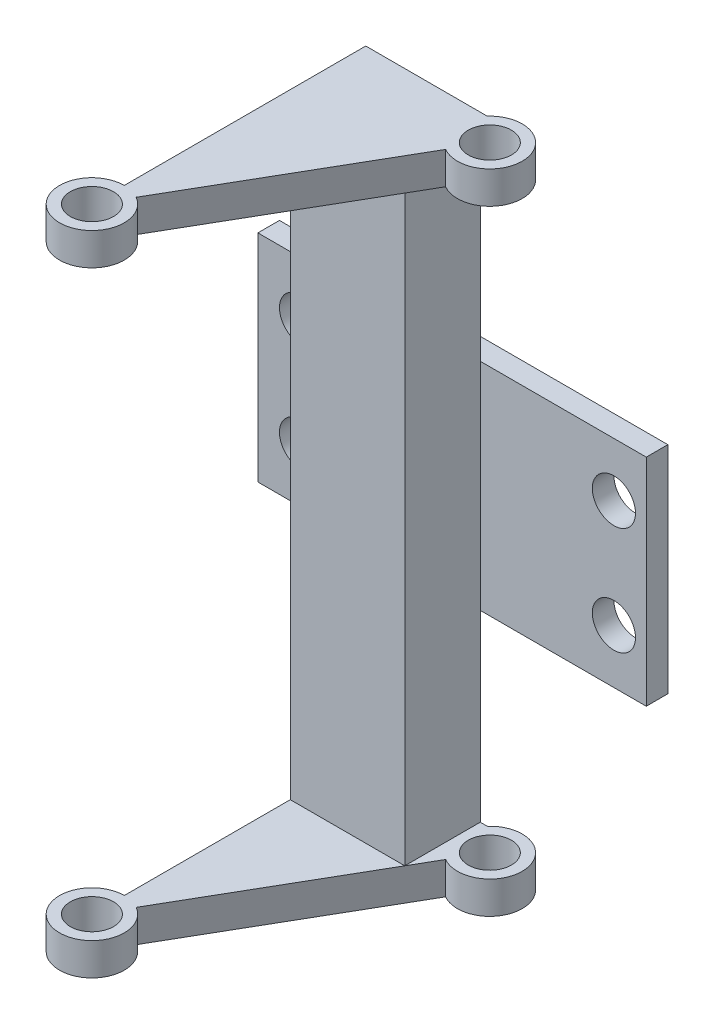
ISO-10303-21;
HEADER;
FILE_DESCRIPTION(('STEP AP214'),'2;1');
FILE_NAME('part.step','',(''),(''),'','','');
FILE_SCHEMA(('AUTOMOTIVE_DESIGN { 1 0 10303 214 1 1 1 1 }'));
ENDSEC;
DATA;
#1=APPLICATION_CONTEXT('core data for automotive mechanical design processes');
#2=APPLICATION_PROTOCOL_DEFINITION('international standard','automotive_design',2000,#1);
#3=PRODUCT_CONTEXT('',#1,'mechanical');
#4=PRODUCT('Part','Part','',(#3));
#5=PRODUCT_RELATED_PRODUCT_CATEGORY('part','',(#4));
#6=PRODUCT_DEFINITION_FORMATION('','',#4);
#7=PRODUCT_DEFINITION_CONTEXT('part definition',#1,'design');
#8=PRODUCT_DEFINITION('design','',#6,#7);
#9=PRODUCT_DEFINITION_SHAPE('','',#8);
#10=(LENGTH_UNIT() NAMED_UNIT(*) SI_UNIT(.MILLI.,.METRE.));
#11=(NAMED_UNIT(*) PLANE_ANGLE_UNIT() SI_UNIT($,.RADIAN.));
#12=(NAMED_UNIT(*) SI_UNIT($,.STERADIAN.) SOLID_ANGLE_UNIT());
#13=UNCERTAINTY_MEASURE_WITH_UNIT(LENGTH_MEASURE(1.E-05),#10,'distance_accuracy_value','');
#14=(GEOMETRIC_REPRESENTATION_CONTEXT(3) GLOBAL_UNCERTAINTY_ASSIGNED_CONTEXT((#13)) GLOBAL_UNIT_ASSIGNED_CONTEXT((#10,
#11,#12)) REPRESENTATION_CONTEXT('',''));
#15=CARTESIAN_POINT('',(0.,0.,0.));
#16=DIRECTION('',(0.,0.,1.));
#17=DIRECTION('',(1.,0.,0.));
#18=AXIS2_PLACEMENT_3D('',#15,#16,#17);
#19=CARTESIAN_POINT('',(0.,0.,1.));
#20=DIRECTION('',(0.,0.,-1.));
#21=DIRECTION('',(-1.,0.,0.));
#22=AXIS2_PLACEMENT_3D('',#19,#20,#21);
#23=PLANE('',#22);
#24=CARTESIAN_POINT('',(4.,15.,1.));
#25=DIRECTION('',(0.,0.,1.));
#26=DIRECTION('',(1.,0.,0.));
#27=AXIS2_PLACEMENT_3D('',#24,#25,#26);
#28=CIRCLE('',#27,2.);
#29=CARTESIAN_POINT('',(6.,15.,1.));
#30=VERTEX_POINT('',#29);
#31=EDGE_CURVE('E112',#30,#30,#28,.T.);
#32=ORIENTED_EDGE('',*,*,#31,.F.);
#33=EDGE_LOOP('',(#32));
#34=FACE_BOUND('',#33,.T.);
#35=CARTESIAN_POINT('',(4.,5.,1.));
#36=DIRECTION('',(0.,0.,1.));
#37=DIRECTION('',(1.,0.,0.));
#38=AXIS2_PLACEMENT_3D('',#35,#36,#37);
#39=CIRCLE('',#38,2.);
#40=CARTESIAN_POINT('',(6.,5.,1.));
#41=VERTEX_POINT('',#40);
#42=EDGE_CURVE('E157',#41,#41,#39,.T.);
#43=ORIENTED_EDGE('',*,*,#42,.F.);
#44=EDGE_LOOP('',(#43));
#45=FACE_BOUND('',#44,.T.);
#46=DIRECTION('',(0.,-1.,0.));
#47=VECTOR('',#46,1.);
#48=CARTESIAN_POINT('',(10.,37.,1.));
#49=LINE('',#48,#47);
#50=CARTESIAN_POINT('',(10.,20.,1.));
#51=VERTEX_POINT('',#50);
#52=CARTESIAN_POINT('',(10.,0.,1.));
#53=VERTEX_POINT('',#52);
#54=EDGE_CURVE('E11',#51,#53,#49,.T.);
#55=ORIENTED_EDGE('',*,*,#54,.F.);
#56=DIRECTION('',(-1.,0.,0.));
#57=VECTOR('',#56,1.);
#58=CARTESIAN_POINT('',(0.,20.,1.));
#59=LINE('',#58,#57);
#60=CARTESIAN_POINT('',(0.,20.,1.));
#61=VERTEX_POINT('',#60);
#62=EDGE_CURVE('E68',#51,#61,#59,.T.);
#63=ORIENTED_EDGE('',*,*,#62,.T.);
#64=DIRECTION('',(0.,-1.,0.));
#65=VECTOR('',#64,1.);
#66=CARTESIAN_POINT('',(0.,0.,1.));
#67=LINE('',#66,#65);
#68=CARTESIAN_POINT('',(0.,0.,1.));
#69=VERTEX_POINT('',#68);
#70=EDGE_CURVE('E96',#61,#69,#67,.T.);
#71=ORIENTED_EDGE('',*,*,#70,.T.);
#72=DIRECTION('',(1.,0.,0.));
#73=VECTOR('',#72,1.);
#74=CARTESIAN_POINT('',(0.,0.,1.));
#75=LINE('',#74,#73);
#76=EDGE_CURVE('E169',#69,#53,#75,.T.);
#77=ORIENTED_EDGE('',*,*,#76,.T.);
#78=EDGE_LOOP('',(#55,#63,#71,#77));
#79=FACE_BOUND('',#78,.T.);
#80=ADVANCED_FACE('F39',(#34,#45,#79),#23,.F.);
#81=CARTESIAN_POINT('',(33.,15.,1.));
#82=DIRECTION('',(0.,0.,1.));
#83=DIRECTION('',(1.,0.,0.));
#84=AXIS2_PLACEMENT_3D('',#81,#82,#83);
#85=CIRCLE('',#84,2.);
#86=CARTESIAN_POINT('',(35.,15.,1.));
#87=VERTEX_POINT('',#86);
#88=EDGE_CURVE('E127',#87,#87,#85,.T.);
#89=ORIENTED_EDGE('',*,*,#88,.F.);
#90=EDGE_LOOP('',(#89));
#91=FACE_BOUND('',#90,.T.);
#92=CARTESIAN_POINT('',(33.,5.,1.));
#93=DIRECTION('',(0.,0.,1.));
#94=DIRECTION('',(1.,0.,0.));
#95=AXIS2_PLACEMENT_3D('',#92,#93,#94);
#96=CIRCLE('',#95,2.);
#97=CARTESIAN_POINT('',(35.,5.,1.));
#98=VERTEX_POINT('',#97);
#99=EDGE_CURVE('E135',#98,#98,#96,.T.);
#100=ORIENTED_EDGE('',*,*,#99,.F.);
#101=EDGE_LOOP('',(#100));
#102=FACE_BOUND('',#101,.T.);
#103=CARTESIAN_POINT('',(36.,20.,1.));
#104=VERTEX_POINT('',#103);
#105=CARTESIAN_POINT('',(20.6143351817255,20.,1.));
#106=VERTEX_POINT('',#105);
#107=EDGE_CURVE('E105',#104,#106,#59,.T.);
#108=ORIENTED_EDGE('',*,*,#107,.T.);
#109=DIRECTION('',(0.,-1.,0.));
#110=VECTOR('',#109,1.);
#111=CARTESIAN_POINT('',(20.6143351817255,37.,1.));
#112=LINE('',#111,#110);
#113=CARTESIAN_POINT('',(20.6143351817255,0.,1.));
#114=VERTEX_POINT('',#113);
#115=EDGE_CURVE('E49',#106,#114,#112,.T.);
#116=ORIENTED_EDGE('',*,*,#115,.T.);
#117=CARTESIAN_POINT('',(36.,0.,1.));
#118=VERTEX_POINT('',#117);
#119=EDGE_CURVE('E168',#114,#118,#75,.T.);
#120=ORIENTED_EDGE('',*,*,#119,.T.);
#121=DIRECTION('',(0.,-1.,0.));
#122=VECTOR('',#121,1.);
#123=CARTESIAN_POINT('',(36.,20.,1.));
#124=LINE('',#123,#122);
#125=EDGE_CURVE('E133',#104,#118,#124,.T.);
#126=ORIENTED_EDGE('',*,*,#125,.F.);
#127=EDGE_LOOP('',(#108,#116,#120,#126));
#128=FACE_BOUND('',#127,.T.);
#129=ADVANCED_FACE('F186',(#91,#102,#128),#23,.F.);
#130=CARTESIAN_POINT('',(0.,0.,-1.));
#131=DIRECTION('',(0.,0.,-1.));
#132=DIRECTION('',(-1.,0.,0.));
#133=AXIS2_PLACEMENT_3D('',#130,#131,#132);
#134=PLANE('',#133);
#135=CARTESIAN_POINT('',(33.,15.,-1.));
#136=DIRECTION('',(0.,0.,-1.));
#137=DIRECTION('',(-1.,0.,0.));
#138=AXIS2_PLACEMENT_3D('',#135,#136,#137);
#139=CIRCLE('',#138,2.);
#140=CARTESIAN_POINT('',(31.,15.,-1.));
#141=VERTEX_POINT('',#140);
#142=EDGE_CURVE('E43',#141,#141,#139,.T.);
#143=ORIENTED_EDGE('',*,*,#142,.F.);
#144=EDGE_LOOP('',(#143));
#145=FACE_BOUND('',#144,.T.);
#146=CARTESIAN_POINT('',(33.,5.,-1.));
#147=DIRECTION('',(0.,0.,-1.));
#148=DIRECTION('',(-1.,0.,0.));
#149=AXIS2_PLACEMENT_3D('',#146,#147,#148);
#150=CIRCLE('',#149,2.);
#151=CARTESIAN_POINT('',(31.,5.,-1.));
#152=VERTEX_POINT('',#151);
#153=EDGE_CURVE('E124',#152,#152,#150,.T.);
#154=ORIENTED_EDGE('',*,*,#153,.F.);
#155=EDGE_LOOP('',(#154));
#156=FACE_BOUND('',#155,.T.);
#157=CARTESIAN_POINT('',(4.,15.,-1.));
#158=DIRECTION('',(0.,0.,1.));
#159=DIRECTION('',(1.,0.,0.));
#160=AXIS2_PLACEMENT_3D('',#157,#158,#159);
#161=CIRCLE('',#160,2.);
#162=CARTESIAN_POINT('',(6.,15.,-1.));
#163=VERTEX_POINT('',#162);
#164=EDGE_CURVE('E118',#163,#163,#161,.T.);
#165=ORIENTED_EDGE('',*,*,#164,.T.);
#166=EDGE_LOOP('',(#165));
#167=FACE_BOUND('',#166,.T.);
#168=DIRECTION('',(0.,-1.,0.));
#169=VECTOR('',#168,1.);
#170=CARTESIAN_POINT('',(0.,0.,-1.));
#171=LINE('',#170,#169);
#172=CARTESIAN_POINT('',(0.,20.,-1.));
#173=VERTEX_POINT('',#172);
#174=CARTESIAN_POINT('',(0.,0.,-1.));
#175=VERTEX_POINT('',#174);
#176=EDGE_CURVE('E102',#173,#175,#171,.T.);
#177=ORIENTED_EDGE('',*,*,#176,.F.);
#178=DIRECTION('',(-1.,0.,0.));
#179=VECTOR('',#178,1.);
#180=CARTESIAN_POINT('',(0.,20.,-1.));
#181=LINE('',#180,#179);
#182=CARTESIAN_POINT('',(36.,20.,-1.));
#183=VERTEX_POINT('',#182);
#184=EDGE_CURVE('E82',#183,#173,#181,.T.);
#185=ORIENTED_EDGE('',*,*,#184,.F.);
#186=DIRECTION('',(0.,1.,0.));
#187=VECTOR('',#186,1.);
#188=CARTESIAN_POINT('',(36.,20.,-1.));
#189=LINE('',#188,#187);
#190=CARTESIAN_POINT('',(36.,0.,-1.));
#191=VERTEX_POINT('',#190);
#192=EDGE_CURVE('E151',#191,#183,#189,.T.);
#193=ORIENTED_EDGE('',*,*,#192,.F.);
#194=DIRECTION('',(1.,0.,0.));
#195=VECTOR('',#194,1.);
#196=CARTESIAN_POINT('',(0.,0.,-1.));
#197=LINE('',#196,#195);
#198=EDGE_CURVE('E97',#175,#191,#197,.T.);
#199=ORIENTED_EDGE('',*,*,#198,.F.);
#200=EDGE_LOOP('',(#177,#185,#193,#199));
#201=FACE_BOUND('',#200,.T.);
#202=CARTESIAN_POINT('',(4.,5.,-1.));
#203=DIRECTION('',(0.,0.,1.));
#204=DIRECTION('',(1.,0.,0.));
#205=AXIS2_PLACEMENT_3D('',#202,#203,#204);
#206=CIRCLE('',#205,2.);
#207=CARTESIAN_POINT('',(6.,5.,-1.));
#208=VERTEX_POINT('',#207);
#209=EDGE_CURVE('E156',#208,#208,#206,.T.);
#210=ORIENTED_EDGE('',*,*,#209,.T.);
#211=EDGE_LOOP('',(#210));
#212=FACE_BOUND('',#211,.T.);
#213=ADVANCED_FACE('F107',(#145,#156,#167,#201,#212),#134,.T.);
#214=CARTESIAN_POINT('',(0.,0.,1.));
#215=DIRECTION('',(1.,0.,0.));
#216=DIRECTION('',(0.,0.,-1.));
#217=AXIS2_PLACEMENT_3D('',#214,#215,#216);
#218=PLANE('',#217);
#219=ORIENTED_EDGE('',*,*,#176,.T.);
#220=DIRECTION('',(0.,0.,-1.));
#221=VECTOR('',#220,1.);
#222=CARTESIAN_POINT('',(0.,0.,1.));
#223=LINE('',#222,#221);
#224=EDGE_CURVE('E104',#69,#175,#223,.T.);
#225=ORIENTED_EDGE('',*,*,#224,.F.);
#226=ORIENTED_EDGE('',*,*,#70,.F.);
#227=DIRECTION('',(0.,0.,-1.));
#228=VECTOR('',#227,1.);
#229=CARTESIAN_POINT('',(0.,20.,1.));
#230=LINE('',#229,#228);
#231=EDGE_CURVE('E85',#61,#173,#230,.T.);
#232=ORIENTED_EDGE('',*,*,#231,.T.);
#233=EDGE_LOOP('',(#219,#225,#226,#232));
#234=FACE_BOUND('',#233,.T.);
#235=ADVANCED_FACE('F41',(#234),#218,.F.);
#236=CARTESIAN_POINT('',(0.,0.,1.));
#237=DIRECTION('',(0.,1.,0.));
#238=DIRECTION('',(0.,0.,1.));
#239=AXIS2_PLACEMENT_3D('',#236,#237,#238);
#240=PLANE('',#239);
#241=ORIENTED_EDGE('',*,*,#198,.T.);
#242=DIRECTION('',(0.,0.,-1.));
#243=VECTOR('',#242,1.);
#244=CARTESIAN_POINT('',(36.,0.,1.));
#245=LINE('',#244,#243);
#246=EDGE_CURVE('E147',#118,#191,#245,.T.);
#247=ORIENTED_EDGE('',*,*,#246,.F.);
#248=ORIENTED_EDGE('',*,*,#119,.F.);
#249=EDGE_CURVE('E172',#53,#114,#75,.T.);
#250=ORIENTED_EDGE('',*,*,#249,.F.);
#251=ORIENTED_EDGE('',*,*,#76,.F.);
#252=ORIENTED_EDGE('',*,*,#224,.T.);
#253=EDGE_LOOP('',(#241,#247,#248,#250,#251,#252));
#254=FACE_BOUND('',#253,.T.);
#255=ADVANCED_FACE('F192',(#254),#240,.F.);
#256=CARTESIAN_POINT('',(0.,20.,1.));
#257=DIRECTION('',(0.,-1.,0.));
#258=DIRECTION('',(0.,0.,-1.));
#259=AXIS2_PLACEMENT_3D('',#256,#257,#258);
#260=PLANE('',#259);
#261=ORIENTED_EDGE('',*,*,#184,.T.);
#262=ORIENTED_EDGE('',*,*,#231,.F.);
#263=ORIENTED_EDGE('',*,*,#62,.F.);
#264=EDGE_CURVE('E176',#106,#51,#59,.T.);
#265=ORIENTED_EDGE('',*,*,#264,.F.);
#266=ORIENTED_EDGE('',*,*,#107,.F.);
#267=DIRECTION('',(0.,0.,1.));
#268=VECTOR('',#267,1.);
#269=CARTESIAN_POINT('',(36.,20.,1.));
#270=LINE('',#269,#268);
#271=EDGE_CURVE('E90',#183,#104,#270,.T.);
#272=ORIENTED_EDGE('',*,*,#271,.F.);
#273=EDGE_LOOP('',(#261,#262,#263,#265,#266,#272));
#274=FACE_BOUND('',#273,.T.);
#275=ADVANCED_FACE('F84',(#274),#260,.F.);
#276=CARTESIAN_POINT('',(4.,15.,1.));
#277=DIRECTION('',(0.,0.,-1.));
#278=DIRECTION('',(-1.,0.,0.));
#279=AXIS2_PLACEMENT_3D('',#276,#277,#278);
#280=CYLINDRICAL_SURFACE('',#279,2.);
#281=ORIENTED_EDGE('',*,*,#31,.T.);
#282=EDGE_LOOP('',(#281));
#283=FACE_BOUND('',#282,.T.);
#284=ORIENTED_EDGE('',*,*,#164,.F.);
#285=EDGE_LOOP('',(#284));
#286=FACE_BOUND('',#285,.T.);
#287=ADVANCED_FACE('F517',(#283,#286),#280,.F.);
#288=CARTESIAN_POINT('',(4.,5.,1.));
#289=DIRECTION('',(0.,0.,-1.));
#290=DIRECTION('',(-1.,0.,0.));
#291=AXIS2_PLACEMENT_3D('',#288,#289,#290);
#292=CYLINDRICAL_SURFACE('',#291,2.);
#293=ORIENTED_EDGE('',*,*,#42,.T.);
#294=EDGE_LOOP('',(#293));
#295=FACE_BOUND('',#294,.T.);
#296=ORIENTED_EDGE('',*,*,#209,.F.);
#297=EDGE_LOOP('',(#296));
#298=FACE_BOUND('',#297,.T.);
#299=ADVANCED_FACE('F769',(#295,#298),#292,.F.);
#300=CARTESIAN_POINT('',(36.,0.,0.));
#301=DIRECTION('',(1.,0.,0.));
#302=DIRECTION('',(0.,1.,0.));
#303=AXIS2_PLACEMENT_3D('',#300,#301,#302);
#304=PLANE('',#303);
#305=ORIENTED_EDGE('',*,*,#125,.T.);
#306=ORIENTED_EDGE('',*,*,#246,.T.);
#307=ORIENTED_EDGE('',*,*,#192,.T.);
#308=ORIENTED_EDGE('',*,*,#271,.T.);
#309=EDGE_LOOP('',(#305,#306,#307,#308));
#310=FACE_BOUND('',#309,.T.);
#311=ADVANCED_FACE('F194',(#310),#304,.T.);
#312=CARTESIAN_POINT('',(33.,5.,-5.));
#313=DIRECTION('',(0.,0.,1.));
#314=DIRECTION('',(1.,0.,0.));
#315=AXIS2_PLACEMENT_3D('',#312,#313,#314);
#316=CYLINDRICAL_SURFACE('',#315,2.);
#317=ORIENTED_EDGE('',*,*,#153,.T.);
#318=EDGE_LOOP('',(#317));
#319=FACE_BOUND('',#318,.T.);
#320=ORIENTED_EDGE('',*,*,#99,.T.);
#321=EDGE_LOOP('',(#320));
#322=FACE_BOUND('',#321,.T.);
#323=ADVANCED_FACE('F764',(#319,#322),#316,.F.);
#324=CARTESIAN_POINT('',(33.,15.,-5.));
#325=DIRECTION('',(0.,0.,1.));
#326=DIRECTION('',(1.,0.,0.));
#327=AXIS2_PLACEMENT_3D('',#324,#325,#326);
#328=CYLINDRICAL_SURFACE('',#327,2.);
#329=ORIENTED_EDGE('',*,*,#142,.T.);
#330=EDGE_LOOP('',(#329));
#331=FACE_BOUND('',#330,.T.);
#332=ORIENTED_EDGE('',*,*,#88,.T.);
#333=EDGE_LOOP('',(#332));
#334=FACE_BOUND('',#333,.T.);
#335=ADVANCED_FACE('F568',(#331,#334),#328,.F.);
#336=CARTESIAN_POINT('',(10.,37.,1.));
#337=DIRECTION('',(0.,0.,1.));
#338=DIRECTION('',(1.,0.,0.));
#339=AXIS2_PLACEMENT_3D('',#336,#337,#338);
#340=PLANE('',#339);
#341=CARTESIAN_POINT('',(10.,-20.,1.));
#342=VERTEX_POINT('',#341);
#343=EDGE_CURVE('E52',#53,#342,#49,.T.);
#344=ORIENTED_EDGE('',*,*,#343,.F.);
#345=ORIENTED_EDGE('',*,*,#249,.T.);
#346=CARTESIAN_POINT('',(20.6143351817255,-17.,1.));
#347=VERTEX_POINT('',#346);
#348=EDGE_CURVE('E59',#114,#347,#112,.T.);
#349=ORIENTED_EDGE('',*,*,#348,.T.);
#350=DIRECTION('',(1.,0.,0.));
#351=VECTOR('',#350,1.);
#352=CARTESIAN_POINT('',(10.,-17.,1.));
#353=LINE('',#352,#351);
#354=CARTESIAN_POINT('',(21.2639320225002,-17.,1.));
#355=VERTEX_POINT('',#354);
#356=EDGE_CURVE('E364',#347,#355,#353,.T.);
#357=ORIENTED_EDGE('',*,*,#356,.T.);
#358=DIRECTION('',(0.,1.,0.));
#359=VECTOR('',#358,1.);
#360=CARTESIAN_POINT('',(21.2639320225002,-20.,1.));
#361=LINE('',#360,#359);
#362=CARTESIAN_POINT('',(21.2639320225002,-20.,1.));
#363=VERTEX_POINT('',#362);
#364=EDGE_CURVE('E413',#363,#355,#361,.T.);
#365=ORIENTED_EDGE('',*,*,#364,.F.);
#366=DIRECTION('',(1.,0.,0.));
#367=VECTOR('',#366,1.);
#368=CARTESIAN_POINT('',(10.,-20.,1.));
#369=LINE('',#368,#367);
#370=EDGE_CURVE('E372',#342,#363,#369,.T.);
#371=ORIENTED_EDGE('',*,*,#370,.F.);
#372=EDGE_LOOP('',(#344,#345,#349,#357,#365,#371));
#373=FACE_BOUND('',#372,.T.);
#374=ADVANCED_FACE('F453',(#373),#340,.F.);
#375=CARTESIAN_POINT('',(20.6143351817255,37.,1.));
#376=VERTEX_POINT('',#375);
#377=EDGE_CURVE('E432',#376,#106,#112,.T.);
#378=ORIENTED_EDGE('',*,*,#377,.T.);
#379=ORIENTED_EDGE('',*,*,#264,.T.);
#380=CARTESIAN_POINT('',(10.,40.,1.));
#381=VERTEX_POINT('',#380);
#382=EDGE_CURVE('E51',#381,#51,#49,.T.);
#383=ORIENTED_EDGE('',*,*,#382,.F.);
#384=DIRECTION('',(1.,0.,0.));
#385=VECTOR('',#384,1.);
#386=CARTESIAN_POINT('',(0.,40.,1.));
#387=LINE('',#386,#385);
#388=CARTESIAN_POINT('',(21.2639320225002,40.,0.999999999999999));
#389=VERTEX_POINT('',#388);
#390=EDGE_CURVE('E298',#381,#389,#387,.T.);
#391=ORIENTED_EDGE('',*,*,#390,.T.);
#392=DIRECTION('',(0.,-1.,0.));
#393=VECTOR('',#392,1.);
#394=CARTESIAN_POINT('',(21.2639320225002,40.,0.999999999999999));
#395=LINE('',#394,#393);
#396=CARTESIAN_POINT('',(21.2639320225002,37.,0.999999999999999));
#397=VERTEX_POINT('',#396);
#398=EDGE_CURVE('E280',#389,#397,#395,.T.);
#399=ORIENTED_EDGE('',*,*,#398,.T.);
#400=DIRECTION('',(1.,0.,0.));
#401=VECTOR('',#400,1.);
#402=CARTESIAN_POINT('',(0.,37.,1.));
#403=LINE('',#402,#401);
#404=EDGE_CURVE('E327',#376,#397,#403,.T.);
#405=ORIENTED_EDGE('',*,*,#404,.F.);
#406=EDGE_LOOP('',(#378,#379,#383,#391,#399,#405));
#407=FACE_BOUND('',#406,.T.);
#408=ADVANCED_FACE('F305',(#407),#340,.F.);
#409=CARTESIAN_POINT('',(10.,37.,7.99811807886541));
#410=DIRECTION('',(1.,0.,0.));
#411=DIRECTION('',(0.,0.,-1.));
#412=AXIS2_PLACEMENT_3D('',#409,#410,#411);
#413=PLANE('',#412);
#414=ORIENTED_EDGE('',*,*,#343,.T.);
#415=DIRECTION('',(0.,0.,-1.));
#416=VECTOR('',#415,1.);
#417=CARTESIAN_POINT('',(10.,-20.,3.));
#418=LINE('',#417,#416);
#419=CARTESIAN_POINT('',(10.,-20.,23.3826859021798));
#420=VERTEX_POINT('',#419);
#421=EDGE_CURVE('E368',#420,#342,#418,.T.);
#422=ORIENTED_EDGE('',*,*,#421,.F.);
#423=DIRECTION('',(0.,1.,0.));
#424=VECTOR('',#423,1.);
#425=CARTESIAN_POINT('',(10.,-20.,23.3826859021798));
#426=LINE('',#425,#424);
#427=CARTESIAN_POINT('',(10.,-17.,23.3826859021798));
#428=VERTEX_POINT('',#427);
#429=EDGE_CURVE('E386',#420,#428,#426,.T.);
#430=ORIENTED_EDGE('',*,*,#429,.T.);
#431=DIRECTION('',(0.,0.,-1.));
#432=VECTOR('',#431,1.);
#433=CARTESIAN_POINT('',(10.,-17.,3.));
#434=LINE('',#433,#432);
#435=CARTESIAN_POINT('',(10.,-17.,7.99811807886541));
#436=VERTEX_POINT('',#435);
#437=EDGE_CURVE('E373',#428,#436,#434,.T.);
#438=ORIENTED_EDGE('',*,*,#437,.T.);
#439=DIRECTION('',(0.,-1.,0.));
#440=VECTOR('',#439,1.);
#441=CARTESIAN_POINT('',(10.,37.,7.99811807886541));
#442=LINE('',#441,#440);
#443=CARTESIAN_POINT('',(10.,37.,7.99811807886541));
#444=VERTEX_POINT('',#443);
#445=EDGE_CURVE('E438',#444,#436,#442,.T.);
#446=ORIENTED_EDGE('',*,*,#445,.F.);
#447=DIRECTION('',(0.,0.,-1.));
#448=VECTOR('',#447,1.);
#449=CARTESIAN_POINT('',(10.,37.,0.));
#450=LINE('',#449,#448);
#451=CARTESIAN_POINT('',(10.,37.,23.3826859021798));
#452=VERTEX_POINT('',#451);
#453=EDGE_CURVE('E309',#452,#444,#450,.T.);
#454=ORIENTED_EDGE('',*,*,#453,.F.);
#455=DIRECTION('',(0.,-1.,0.));
#456=VECTOR('',#455,1.);
#457=CARTESIAN_POINT('',(10.,40.,23.3826859021798));
#458=LINE('',#457,#456);
#459=CARTESIAN_POINT('',(10.,40.,23.3826859021798));
#460=VERTEX_POINT('',#459);
#461=EDGE_CURVE('E341',#460,#452,#458,.T.);
#462=ORIENTED_EDGE('',*,*,#461,.F.);
#463=DIRECTION('',(0.,0.,-1.));
#464=VECTOR('',#463,1.);
#465=CARTESIAN_POINT('',(10.,40.,0.));
#466=LINE('',#465,#464);
#467=EDGE_CURVE('E291',#460,#381,#466,.T.);
#468=ORIENTED_EDGE('',*,*,#467,.T.);
#469=ORIENTED_EDGE('',*,*,#382,.T.);
#470=ORIENTED_EDGE('',*,*,#54,.T.);
#471=EDGE_LOOP('',(#414,#422,#430,#438,#446,#454,#462,#468,#469,#470));
#472=FACE_BOUND('',#471,.T.);
#473=ADVANCED_FACE('F447',(#472),#413,.F.);
#474=CARTESIAN_POINT('',(20.6143351817255,37.,7.99811807886541));
#475=DIRECTION('',(0.,0.,-1.));
#476=DIRECTION('',(-1.,0.,0.));
#477=AXIS2_PLACEMENT_3D('',#474,#475,#476);
#478=PLANE('',#477);
#479=DIRECTION('',(1.,0.,0.));
#480=VECTOR('',#479,1.);
#481=CARTESIAN_POINT('',(20.6143351817255,-17.,7.99811807886541));
#482=LINE('',#481,#480);
#483=CARTESIAN_POINT('',(20.6143351817255,-17.,7.99811807886541));
#484=VERTEX_POINT('',#483);
#485=EDGE_CURVE('E417',#436,#484,#482,.T.);
#486=ORIENTED_EDGE('',*,*,#485,.T.);
#487=DIRECTION('',(0.,-1.,0.));
#488=VECTOR('',#487,1.);
#489=CARTESIAN_POINT('',(20.6143351817255,37.,7.99811807886541));
#490=LINE('',#489,#488);
#491=CARTESIAN_POINT('',(20.6143351817255,37.,7.99811807886541));
#492=VERTEX_POINT('',#491);
#493=EDGE_CURVE('E435',#492,#484,#490,.T.);
#494=ORIENTED_EDGE('',*,*,#493,.F.);
#495=DIRECTION('',(1.,0.,0.));
#496=VECTOR('',#495,1.);
#497=CARTESIAN_POINT('',(20.6143351817255,37.,7.99811807886541));
#498=LINE('',#497,#496);
#499=EDGE_CURVE('E418',#444,#492,#498,.T.);
#500=ORIENTED_EDGE('',*,*,#499,.F.);
#501=ORIENTED_EDGE('',*,*,#445,.T.);
#502=EDGE_LOOP('',(#486,#494,#500,#501));
#503=FACE_BOUND('',#502,.T.);
#504=ADVANCED_FACE('F463',(#503),#478,.F.);
#505=CARTESIAN_POINT('',(20.6143351817255,37.,1.));
#506=DIRECTION('',(-1.,0.,0.));
#507=DIRECTION('',(0.,0.,1.));
#508=AXIS2_PLACEMENT_3D('',#505,#506,#507);
#509=PLANE('',#508);
#510=DIRECTION('',(0.,0.,-1.));
#511=VECTOR('',#510,1.);
#512=CARTESIAN_POINT('',(20.6143351817255,-17.,1.));
#513=LINE('',#512,#511);
#514=EDGE_CURVE('E423',#484,#347,#513,.T.);
#515=ORIENTED_EDGE('',*,*,#514,.T.);
#516=ORIENTED_EDGE('',*,*,#348,.F.);
#517=ORIENTED_EDGE('',*,*,#115,.F.);
#518=ORIENTED_EDGE('',*,*,#377,.F.);
#519=DIRECTION('',(0.,0.,-1.));
#520=VECTOR('',#519,1.);
#521=CARTESIAN_POINT('',(20.6143351817255,37.,1.));
#522=LINE('',#521,#520);
#523=EDGE_CURVE('E422',#492,#376,#522,.T.);
#524=ORIENTED_EDGE('',*,*,#523,.F.);
#525=ORIENTED_EDGE('',*,*,#493,.T.);
#526=EDGE_LOOP('',(#515,#516,#517,#518,#524,#525));
#527=FACE_BOUND('',#526,.T.);
#528=ADVANCED_FACE('F456',(#527),#509,.F.);
#529=CARTESIAN_POINT('',(23.5,-17.,3.));
#530=DIRECTION('',(0.,-1.,0.));
#531=DIRECTION('',(0.,0.,-1.));
#532=AXIS2_PLACEMENT_3D('',#529,#530,#531);
#533=PLANE('',#532);
#534=ORIENTED_EDGE('',*,*,#514,.F.);
#535=DIRECTION('',(-0.5,0.,0.866025403784439));
#536=VECTOR('',#535,1.);
#537=CARTESIAN_POINT('',(11.5,-17.,23.7846096908265));
#538=LINE('',#537,#536);
#539=CARTESIAN_POINT('',(22.,-17.,5.59807621135332));
#540=VERTEX_POINT('',#539);
#541=EDGE_CURVE('E393',#540,#484,#538,.T.);
#542=ORIENTED_EDGE('',*,*,#541,.F.);
#543=CARTESIAN_POINT('',(23.5,-17.,3.));
#544=DIRECTION('',(0.,-1.,0.));
#545=DIRECTION('',(0.,0.,-1.));
#546=AXIS2_PLACEMENT_3D('',#543,#544,#545);
#547=CIRCLE('',#546,3.);
#548=EDGE_CURVE('E389',#355,#540,#547,.T.);
#549=ORIENTED_EDGE('',*,*,#548,.F.);
#550=ORIENTED_EDGE('',*,*,#356,.F.);
#551=EDGE_LOOP('',(#534,#542,#549,#550));
#552=FACE_BOUND('',#551,.T.);
#553=CARTESIAN_POINT('',(23.5,-17.,3.));
#554=DIRECTION('',(0.,-1.,0.));
#555=DIRECTION('',(0.,0.,-1.));
#556=AXIS2_PLACEMENT_3D('',#553,#554,#555);
#557=CIRCLE('',#556,2.);
#558=CARTESIAN_POINT('',(23.5,-17.,0.999999999999997));
#559=VERTEX_POINT('',#558);
#560=EDGE_CURVE('E356',#559,#559,#557,.T.);
#561=ORIENTED_EDGE('',*,*,#560,.T.);
#562=EDGE_LOOP('',(#561));
#563=FACE_BOUND('',#562,.T.);
#564=ADVANCED_FACE('F460',(#552,#563),#533,.F.);
#565=CARTESIAN_POINT('',(23.5,-20.,3.));
#566=DIRECTION('',(0.,-1.,0.));
#567=DIRECTION('',(0.,0.,-1.));
#568=AXIS2_PLACEMENT_3D('',#565,#566,#567);
#569=PLANE('',#568);
#570=CARTESIAN_POINT('',(23.5,-20.,3.));
#571=DIRECTION('',(0.,-1.,0.));
#572=DIRECTION('',(0.,0.,-1.));
#573=AXIS2_PLACEMENT_3D('',#570,#571,#572);
#574=CIRCLE('',#573,2.);
#575=CARTESIAN_POINT('',(23.5,-20.,0.999999999999997));
#576=VERTEX_POINT('',#575);
#577=EDGE_CURVE('E360',#576,#576,#574,.T.);
#578=ORIENTED_EDGE('',*,*,#577,.F.);
#579=EDGE_LOOP('',(#578));
#580=FACE_BOUND('',#579,.T.);
#581=ORIENTED_EDGE('',*,*,#421,.T.);
#582=ORIENTED_EDGE('',*,*,#370,.T.);
#583=CARTESIAN_POINT('',(23.5,-20.,3.));
#584=DIRECTION('',(0.,-1.,0.));
#585=DIRECTION('',(0.,0.,-1.));
#586=AXIS2_PLACEMENT_3D('',#583,#584,#585);
#587=CIRCLE('',#586,3.);
#588=CARTESIAN_POINT('',(22.,-20.,5.59807621135332));
#589=VERTEX_POINT('',#588);
#590=EDGE_CURVE('E376',#363,#589,#587,.T.);
#591=ORIENTED_EDGE('',*,*,#590,.T.);
#592=DIRECTION('',(-0.5,0.,0.866025403784439));
#593=VECTOR('',#592,1.);
#594=CARTESIAN_POINT('',(11.5,-20.,23.7846096908265));
#595=LINE('',#594,#593);
#596=CARTESIAN_POINT('',(11.5,-20.,23.7846096908265));
#597=VERTEX_POINT('',#596);
#598=EDGE_CURVE('E379',#589,#597,#595,.T.);
#599=ORIENTED_EDGE('',*,*,#598,.T.);
#600=CARTESIAN_POINT('',(10.,-20.,26.3826859021798));
#601=DIRECTION('',(0.,-1.,0.));
#602=DIRECTION('',(0.,0.,-1.));
#603=AXIS2_PLACEMENT_3D('',#600,#601,#602);
#604=CIRCLE('',#603,3.);
#605=EDGE_CURVE('E382',#597,#420,#604,.T.);
#606=ORIENTED_EDGE('',*,*,#605,.T.);
#607=EDGE_LOOP('',(#581,#582,#591,#599,#606));
#608=FACE_BOUND('',#607,.T.);
#609=CARTESIAN_POINT('',(10.,-20.,26.3826859021798));
#610=DIRECTION('',(0.,-1.,0.));
#611=DIRECTION('',(0.,0.,-1.));
#612=AXIS2_PLACEMENT_3D('',#609,#610,#611);
#613=CIRCLE('',#612,2.);
#614=CARTESIAN_POINT('',(10.,-20.,24.3826859021798));
#615=VERTEX_POINT('',#614);
#616=EDGE_CURVE('E352',#615,#615,#613,.T.);
#617=ORIENTED_EDGE('',*,*,#616,.F.);
#618=EDGE_LOOP('',(#617));
#619=FACE_BOUND('',#618,.T.);
#620=ADVANCED_FACE('F484',(#580,#608,#619),#569,.T.);
#621=ORIENTED_EDGE('',*,*,#485,.F.);
#622=ORIENTED_EDGE('',*,*,#437,.F.);
#623=CARTESIAN_POINT('',(10.,-17.,26.3826859021798));
#624=DIRECTION('',(0.,-1.,0.));
#625=DIRECTION('',(0.,0.,-1.));
#626=AXIS2_PLACEMENT_3D('',#623,#624,#625);
#627=CIRCLE('',#626,3.);
#628=CARTESIAN_POINT('',(11.5,-17.,23.7846096908265));
#629=VERTEX_POINT('',#628);
#630=EDGE_CURVE('E396',#629,#428,#627,.T.);
#631=ORIENTED_EDGE('',*,*,#630,.F.);
#632=EDGE_CURVE('E392',#484,#629,#538,.T.);
#633=ORIENTED_EDGE('',*,*,#632,.F.);
#634=EDGE_LOOP('',(#621,#622,#631,#633));
#635=FACE_BOUND('',#634,.T.);
#636=CARTESIAN_POINT('',(10.,-17.,26.3826859021798));
#637=DIRECTION('',(0.,-1.,0.));
#638=DIRECTION('',(0.,0.,-1.));
#639=AXIS2_PLACEMENT_3D('',#636,#637,#638);
#640=CIRCLE('',#639,2.);
#641=CARTESIAN_POINT('',(10.,-17.,24.3826859021798));
#642=VERTEX_POINT('',#641);
#643=EDGE_CURVE('E345',#642,#642,#640,.T.);
#644=ORIENTED_EDGE('',*,*,#643,.T.);
#645=EDGE_LOOP('',(#644));
#646=FACE_BOUND('',#645,.T.);
#647=ADVANCED_FACE('F467',(#635,#646),#533,.F.);
#648=CARTESIAN_POINT('',(23.5,-20.,3.));
#649=DIRECTION('',(0.,1.,0.));
#650=DIRECTION('',(0.,0.,1.));
#651=AXIS2_PLACEMENT_3D('',#648,#649,#650);
#652=CYLINDRICAL_SURFACE('',#651,3.);
#653=ORIENTED_EDGE('',*,*,#548,.T.);
#654=DIRECTION('',(0.,1.,0.));
#655=VECTOR('',#654,1.);
#656=CARTESIAN_POINT('',(22.,-20.,5.59807621135332));
#657=LINE('',#656,#655);
#658=EDGE_CURVE('E409',#589,#540,#657,.T.);
#659=ORIENTED_EDGE('',*,*,#658,.F.);
#660=ORIENTED_EDGE('',*,*,#590,.F.);
#661=ORIENTED_EDGE('',*,*,#364,.T.);
#662=EDGE_LOOP('',(#653,#659,#660,#661));
#663=FACE_BOUND('',#662,.T.);
#664=ADVANCED_FACE('F482',(#663),#652,.T.);
#665=CARTESIAN_POINT('',(11.5,-20.,23.7846096908265));
#666=DIRECTION('',(-0.866025403784439,0.,-0.5));
#667=DIRECTION('',(-0.5,0.,0.866025403784439));
#668=AXIS2_PLACEMENT_3D('',#665,#666,#667);
#669=PLANE('',#668);
#670=ORIENTED_EDGE('',*,*,#541,.T.);
#671=ORIENTED_EDGE('',*,*,#632,.T.);
#672=DIRECTION('',(0.,1.,0.));
#673=VECTOR('',#672,1.);
#674=CARTESIAN_POINT('',(11.5,-20.,23.7846096908265));
#675=LINE('',#674,#673);
#676=EDGE_CURVE('E405',#597,#629,#675,.T.);
#677=ORIENTED_EDGE('',*,*,#676,.F.);
#678=ORIENTED_EDGE('',*,*,#598,.F.);
#679=ORIENTED_EDGE('',*,*,#658,.T.);
#680=EDGE_LOOP('',(#670,#671,#677,#678,#679));
#681=FACE_BOUND('',#680,.T.);
#682=ADVANCED_FACE('F477',(#681),#669,.F.);
#683=CARTESIAN_POINT('',(10.,-20.,26.3826859021798));
#684=DIRECTION('',(0.,1.,0.));
#685=DIRECTION('',(0.,0.,1.));
#686=AXIS2_PLACEMENT_3D('',#683,#684,#685);
#687=CYLINDRICAL_SURFACE('',#686,3.);
#688=ORIENTED_EDGE('',*,*,#630,.T.);
#689=ORIENTED_EDGE('',*,*,#429,.F.);
#690=ORIENTED_EDGE('',*,*,#605,.F.);
#691=ORIENTED_EDGE('',*,*,#676,.T.);
#692=EDGE_LOOP('',(#688,#689,#690,#691));
#693=FACE_BOUND('',#692,.T.);
#694=ADVANCED_FACE('F473',(#693),#687,.T.);
#695=CARTESIAN_POINT('',(23.5,-20.,3.));
#696=DIRECTION('',(0.,1.,0.));
#697=DIRECTION('',(0.,0.,1.));
#698=AXIS2_PLACEMENT_3D('',#695,#696,#697);
#699=CYLINDRICAL_SURFACE('',#698,2.);
#700=ORIENTED_EDGE('',*,*,#577,.T.);
#701=EDGE_LOOP('',(#700));
#702=FACE_BOUND('',#701,.T.);
#703=ORIENTED_EDGE('',*,*,#560,.F.);
#704=EDGE_LOOP('',(#703));
#705=FACE_BOUND('',#704,.T.);
#706=ADVANCED_FACE('F495',(#702,#705),#699,.F.);
#707=CARTESIAN_POINT('',(10.,-20.,26.3826859021798));
#708=DIRECTION('',(0.,1.,0.));
#709=DIRECTION('',(0.,0.,1.));
#710=AXIS2_PLACEMENT_3D('',#707,#708,#709);
#711=CYLINDRICAL_SURFACE('',#710,2.);
#712=ORIENTED_EDGE('',*,*,#616,.T.);
#713=EDGE_LOOP('',(#712));
#714=FACE_BOUND('',#713,.T.);
#715=ORIENTED_EDGE('',*,*,#643,.F.);
#716=EDGE_LOOP('',(#715));
#717=FACE_BOUND('',#716,.T.);
#718=ADVANCED_FACE('F491',(#714,#717),#711,.F.);
#719=CARTESIAN_POINT('',(23.5,37.,3.));
#720=DIRECTION('',(0.,-1.,0.));
#721=DIRECTION('',(0.,0.,-1.));
#722=AXIS2_PLACEMENT_3D('',#719,#720,#721);
#723=PLANE('',#722);
#724=CARTESIAN_POINT('',(10.,37.,26.3826859021798));
#725=DIRECTION('',(0.,-1.,0.));
#726=DIRECTION('',(0.,0.,-1.));
#727=AXIS2_PLACEMENT_3D('',#724,#725,#726);
#728=CIRCLE('',#727,2.);
#729=CARTESIAN_POINT('',(10.,37.,24.3826859021798));
#730=VERTEX_POINT('',#729);
#731=EDGE_CURVE('E743',#730,#730,#728,.T.);
#732=ORIENTED_EDGE('',*,*,#731,.F.);
#733=EDGE_LOOP('',(#732));
#734=FACE_BOUND('',#733,.T.);
#735=ORIENTED_EDGE('',*,*,#453,.T.);
#736=ORIENTED_EDGE('',*,*,#499,.T.);
#737=DIRECTION('',(-0.5,0.,0.866025403784439));
#738=VECTOR('',#737,1.);
#739=CARTESIAN_POINT('',(18.9240381056767,37.,10.9257984944672));
#740=LINE('',#739,#738);
#741=CARTESIAN_POINT('',(11.5,37.,23.7846096908265));
#742=VERTEX_POINT('',#741);
#743=EDGE_CURVE('E333',#492,#742,#740,.T.);
#744=ORIENTED_EDGE('',*,*,#743,.T.);
#745=CARTESIAN_POINT('',(10.,37.,26.3826859021798));
#746=DIRECTION('',(0.,-1.,0.));
#747=DIRECTION('',(0.,0.,-1.));
#748=AXIS2_PLACEMENT_3D('',#745,#746,#747);
#749=CIRCLE('',#748,3.);
#750=EDGE_CURVE('E313',#742,#452,#749,.T.);
#751=ORIENTED_EDGE('',*,*,#750,.T.);
#752=EDGE_LOOP('',(#735,#736,#744,#751));
#753=FACE_BOUND('',#752,.T.);
#754=ADVANCED_FACE('F494',(#734,#753),#723,.T.);
#755=CARTESIAN_POINT('',(10.,40.,26.3826859021798));
#756=DIRECTION('',(0.,-1.,0.));
#757=DIRECTION('',(0.,0.,-1.));
#758=AXIS2_PLACEMENT_3D('',#755,#756,#757);
#759=CYLINDRICAL_SURFACE('',#758,3.);
#760=ORIENTED_EDGE('',*,*,#750,.F.);
#761=DIRECTION('',(0.,-1.,0.));
#762=VECTOR('',#761,1.);
#763=CARTESIAN_POINT('',(11.5,40.,23.7846096908265));
#764=LINE('',#763,#762);
#765=CARTESIAN_POINT('',(11.5,40.,23.7846096908265));
#766=VERTEX_POINT('',#765);
#767=EDGE_CURVE('E346',#766,#742,#764,.T.);
#768=ORIENTED_EDGE('',*,*,#767,.F.);
#769=CARTESIAN_POINT('',(10.,40.,26.3826859021798));
#770=DIRECTION('',(0.,-1.,0.));
#771=DIRECTION('',(0.,0.,-1.));
#772=AXIS2_PLACEMENT_3D('',#769,#770,#771);
#773=CIRCLE('',#772,3.);
#774=EDGE_CURVE('E321',#766,#460,#773,.T.);
#775=ORIENTED_EDGE('',*,*,#774,.T.);
#776=ORIENTED_EDGE('',*,*,#461,.T.);
#777=EDGE_LOOP('',(#760,#768,#775,#776));
#778=FACE_BOUND('',#777,.T.);
#779=ADVANCED_FACE('F667',(#778),#759,.T.);
#780=CARTESIAN_POINT('',(18.9240381056767,40.,10.9257984944672));
#781=DIRECTION('',(0.866025403784439,0.,0.5));
#782=DIRECTION('',(0.5,0.,-0.866025403784439));
#783=AXIS2_PLACEMENT_3D('',#780,#781,#782);
#784=PLANE('',#783);
#785=CARTESIAN_POINT('',(22.,37.,5.59807621135332));
#786=VERTEX_POINT('',#785);
#787=EDGE_CURVE('E334',#786,#492,#740,.T.);
#788=ORIENTED_EDGE('',*,*,#787,.F.);
#789=DIRECTION('',(0.,-1.,0.));
#790=VECTOR('',#789,1.);
#791=CARTESIAN_POINT('',(22.,40.,5.59807621135332));
#792=LINE('',#791,#790);
#793=CARTESIAN_POINT('',(22.,40.,5.59807621135332));
#794=VERTEX_POINT('',#793);
#795=EDGE_CURVE('E290',#794,#786,#792,.T.);
#796=ORIENTED_EDGE('',*,*,#795,.F.);
#797=DIRECTION('',(-0.5,0.,0.866025403784439));
#798=VECTOR('',#797,1.);
#799=CARTESIAN_POINT('',(18.9240381056767,40.,10.9257984944672));
#800=LINE('',#799,#798);
#801=EDGE_CURVE('E301',#794,#766,#800,.T.);
#802=ORIENTED_EDGE('',*,*,#801,.T.);
#803=ORIENTED_EDGE('',*,*,#767,.T.);
#804=ORIENTED_EDGE('',*,*,#743,.F.);
#805=EDGE_LOOP('',(#788,#796,#802,#803,#804));
#806=FACE_BOUND('',#805,.T.);
#807=ADVANCED_FACE('F678',(#806),#784,.T.);
#808=CARTESIAN_POINT('',(23.5,40.,3.));
#809=DIRECTION('',(0.,-1.,0.));
#810=DIRECTION('',(0.,0.,-1.));
#811=AXIS2_PLACEMENT_3D('',#808,#809,#810);
#812=CYLINDRICAL_SURFACE('',#811,3.);
#813=CARTESIAN_POINT('',(23.5,37.,3.));
#814=DIRECTION('',(0.,-1.,0.));
#815=DIRECTION('',(0.,0.,-1.));
#816=AXIS2_PLACEMENT_3D('',#813,#814,#815);
#817=CIRCLE('',#816,3.);
#818=EDGE_CURVE('E285',#397,#786,#817,.T.);
#819=ORIENTED_EDGE('',*,*,#818,.F.);
#820=ORIENTED_EDGE('',*,*,#398,.F.);
#821=CARTESIAN_POINT('',(23.5,40.,3.));
#822=DIRECTION('',(0.,-1.,0.));
#823=DIRECTION('',(0.,0.,-1.));
#824=AXIS2_PLACEMENT_3D('',#821,#822,#823);
#825=CIRCLE('',#824,3.);
#826=EDGE_CURVE('E283',#389,#794,#825,.T.);
#827=ORIENTED_EDGE('',*,*,#826,.T.);
#828=ORIENTED_EDGE('',*,*,#795,.T.);
#829=EDGE_LOOP('',(#819,#820,#827,#828));
#830=FACE_BOUND('',#829,.T.);
#831=ADVANCED_FACE('F282',(#830),#812,.T.);
#832=CARTESIAN_POINT('',(23.5,40.,3.));
#833=DIRECTION('',(0.,-1.,0.));
#834=DIRECTION('',(0.,0.,-1.));
#835=AXIS2_PLACEMENT_3D('',#832,#833,#834);
#836=PLANE('',#835);
#837=CARTESIAN_POINT('',(10.,40.,26.3826859021798));
#838=DIRECTION('',(0.,-1.,0.));
#839=DIRECTION('',(0.,0.,-1.));
#840=AXIS2_PLACEMENT_3D('',#837,#838,#839);
#841=CIRCLE('',#840,2.);
#842=CARTESIAN_POINT('',(10.,40.,24.3826859021798));
#843=VERTEX_POINT('',#842);
#844=EDGE_CURVE('E740',#843,#843,#841,.T.);
#845=ORIENTED_EDGE('',*,*,#844,.T.);
#846=EDGE_LOOP('',(#845));
#847=FACE_BOUND('',#846,.T.);
#848=CARTESIAN_POINT('',(23.5,40.,3.));
#849=DIRECTION('',(0.,-1.,0.));
#850=DIRECTION('',(0.,0.,-1.));
#851=AXIS2_PLACEMENT_3D('',#848,#849,#850);
#852=CIRCLE('',#851,2.);
#853=CARTESIAN_POINT('',(23.5,40.,0.999999999999997));
#854=VERTEX_POINT('',#853);
#855=EDGE_CURVE('E330',#854,#854,#852,.T.);
#856=ORIENTED_EDGE('',*,*,#855,.T.);
#857=EDGE_LOOP('',(#856));
#858=FACE_BOUND('',#857,.T.);
#859=ORIENTED_EDGE('',*,*,#390,.F.);
#860=ORIENTED_EDGE('',*,*,#467,.F.);
#861=ORIENTED_EDGE('',*,*,#774,.F.);
#862=ORIENTED_EDGE('',*,*,#801,.F.);
#863=ORIENTED_EDGE('',*,*,#826,.F.);
#864=EDGE_LOOP('',(#859,#860,#861,#862,#863));
#865=FACE_BOUND('',#864,.T.);
#866=ADVANCED_FACE('F296',(#847,#858,#865),#836,.F.);
#867=CARTESIAN_POINT('',(23.5,37.,3.));
#868=DIRECTION('',(0.,-1.,0.));
#869=DIRECTION('',(0.,0.,-1.));
#870=AXIS2_PLACEMENT_3D('',#867,#868,#869);
#871=CIRCLE('',#870,2.);
#872=CARTESIAN_POINT('',(23.5,37.,0.999999999999997));
#873=VERTEX_POINT('',#872);
#874=EDGE_CURVE('E316',#873,#873,#871,.T.);
#875=ORIENTED_EDGE('',*,*,#874,.F.);
#876=EDGE_LOOP('',(#875));
#877=FACE_BOUND('',#876,.T.);
#878=ORIENTED_EDGE('',*,*,#787,.T.);
#879=ORIENTED_EDGE('',*,*,#523,.T.);
#880=ORIENTED_EDGE('',*,*,#404,.T.);
#881=ORIENTED_EDGE('',*,*,#818,.T.);
#882=EDGE_LOOP('',(#878,#879,#880,#881));
#883=FACE_BOUND('',#882,.T.);
#884=ADVANCED_FACE('F670',(#877,#883),#723,.T.);
#885=CARTESIAN_POINT('',(23.5,40.,3.));
#886=DIRECTION('',(0.,-1.,0.));
#887=DIRECTION('',(0.,0.,-1.));
#888=AXIS2_PLACEMENT_3D('',#885,#886,#887);
#889=CYLINDRICAL_SURFACE('',#888,2.);
#890=ORIENTED_EDGE('',*,*,#855,.F.);
#891=EDGE_LOOP('',(#890));
#892=FACE_BOUND('',#891,.T.);
#893=ORIENTED_EDGE('',*,*,#874,.T.);
#894=EDGE_LOOP('',(#893));
#895=FACE_BOUND('',#894,.T.);
#896=ADVANCED_FACE('F714',(#892,#895),#889,.F.);
#897=CARTESIAN_POINT('',(10.,40.,26.3826859021798));
#898=DIRECTION('',(0.,-1.,0.));
#899=DIRECTION('',(0.,0.,-1.));
#900=AXIS2_PLACEMENT_3D('',#897,#898,#899);
#901=CYLINDRICAL_SURFACE('',#900,2.);
#902=ORIENTED_EDGE('',*,*,#844,.F.);
#903=EDGE_LOOP('',(#902));
#904=FACE_BOUND('',#903,.T.);
#905=ORIENTED_EDGE('',*,*,#731,.T.);
#906=EDGE_LOOP('',(#905));
#907=FACE_BOUND('',#906,.T.);
#908=ADVANCED_FACE('F723',(#904,#907),#901,.F.);
#909=CLOSED_SHELL('',(#80,#129,#213,#235,#255,#275,#287,#299,#311,#323,#335,#374,#408,#473,#504,
#528,#564,#620,#647,#664,#682,#694,#706,#718,#754,#779,#807,#831,#866,#884,#896,#908));
#910=MANIFOLD_SOLID_BREP('B2',#909);
#911=ADVANCED_BREP_SHAPE_REPRESENTATION('',(#18,#910),#14);
#912=SHAPE_DEFINITION_REPRESENTATION(#9,#911);
ENDSEC;
END-ISO-10303-21;
